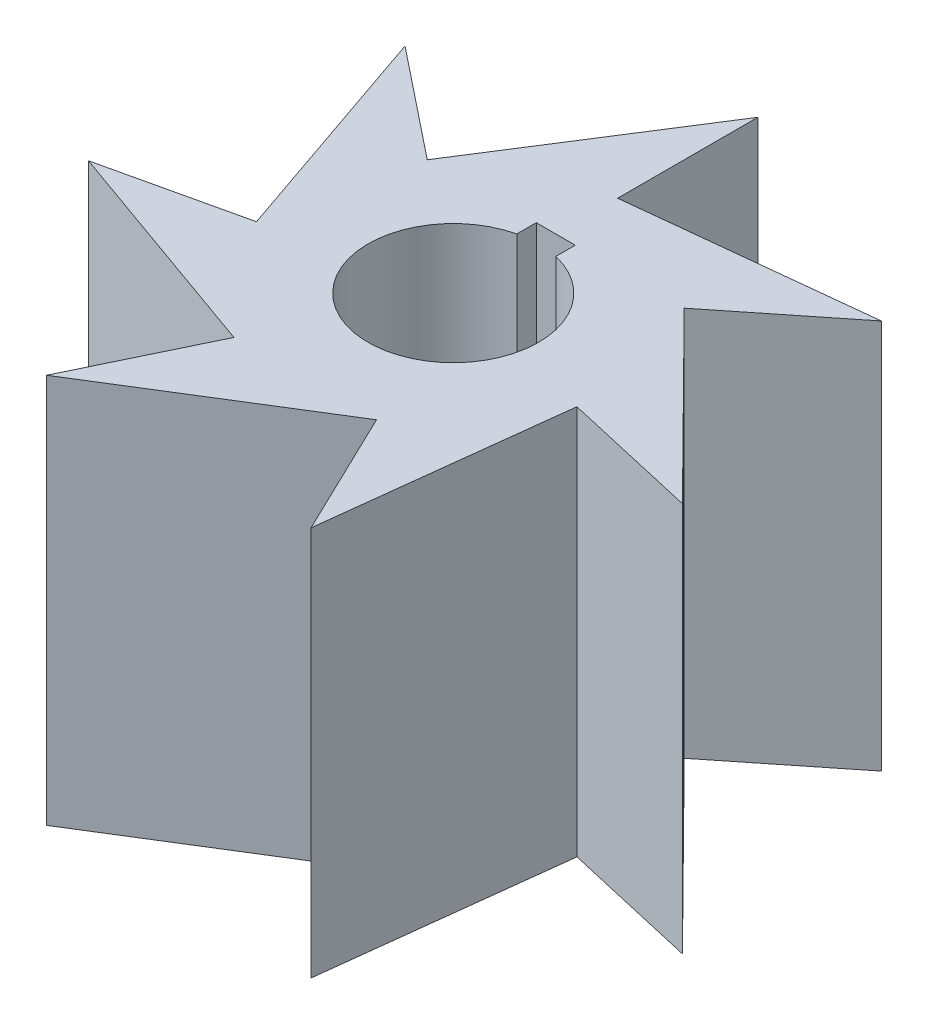
ISO-10303-21;
HEADER;
FILE_DESCRIPTION(('STEP AP214'),'2;1');
FILE_NAME('part.step','',(''),(''),'','','');
FILE_SCHEMA(('AUTOMOTIVE_DESIGN { 1 0 10303 214 1 1 1 1 }'));
ENDSEC;
DATA;
#1=APPLICATION_CONTEXT('core data for automotive mechanical design processes');
#2=APPLICATION_PROTOCOL_DEFINITION('international standard','automotive_design',2000,#1);
#3=PRODUCT_CONTEXT('',#1,'mechanical');
#4=PRODUCT('Part','Part','',(#3));
#5=PRODUCT_RELATED_PRODUCT_CATEGORY('part','',(#4));
#6=PRODUCT_DEFINITION_FORMATION('','',#4);
#7=PRODUCT_DEFINITION_CONTEXT('part definition',#1,'design');
#8=PRODUCT_DEFINITION('design','',#6,#7);
#9=PRODUCT_DEFINITION_SHAPE('','',#8);
#10=(LENGTH_UNIT() NAMED_UNIT(*) SI_UNIT(.MILLI.,.METRE.));
#11=(NAMED_UNIT(*) PLANE_ANGLE_UNIT() SI_UNIT($,.RADIAN.));
#12=(NAMED_UNIT(*) SI_UNIT($,.STERADIAN.) SOLID_ANGLE_UNIT());
#13=UNCERTAINTY_MEASURE_WITH_UNIT(LENGTH_MEASURE(1.E-05),#10,'distance_accuracy_value','');
#14=(GEOMETRIC_REPRESENTATION_CONTEXT(3) GLOBAL_UNCERTAINTY_ASSIGNED_CONTEXT((#13)) GLOBAL_UNIT_ASSIGNED_CONTEXT((#10,
#11,#12)) REPRESENTATION_CONTEXT('',''));
#15=CARTESIAN_POINT('',(0.,0.,0.));
#16=DIRECTION('',(0.,0.,1.));
#17=DIRECTION('',(1.,0.,0.));
#18=AXIS2_PLACEMENT_3D('',#15,#16,#17);
#19=CARTESIAN_POINT('',(0.,80.,0.));
#20=DIRECTION('',(0.,1.,0.));
#21=DIRECTION('',(0.,0.,1.));
#22=AXIS2_PLACEMENT_3D('',#19,#20,#21);
#23=PLANE('',#22);
#24=DIRECTION('',(-0.536459207757481,0.,0.8439262517615));
#25=VECTOR('',#24,1.);
#26=CARTESIAN_POINT('',(-26.3644676542482,80.,-21.0249613663145));
#27=LINE('',#26,#25);
#28=CARTESIAN_POINT('',(0.,80.,-62.4999999999985));
#29=VERTEX_POINT('',#28);
#30=CARTESIAN_POINT('',(-26.3644676542482,80.,-21.0249613663145));
#31=VERTEX_POINT('',#30);
#32=EDGE_CURVE('E194',#29,#31,#27,.T.);
#33=ORIENTED_EDGE('',*,*,#32,.T.);
#34=DIRECTION('',(-0.78183148246803,0.,-0.623489801858734));
#35=VECTOR('',#34,1.);
#36=CARTESIAN_POINT('',(-26.3644676542482,80.,-21.0249613663145));
#37=LINE('',#36,#35);
#38=CARTESIAN_POINT('',(-48.8644676542482,80.,-38.9681126161686));
#39=VERTEX_POINT('',#38);
#40=EDGE_CURVE('E197',#31,#39,#37,.T.);
#41=ORIENTED_EDGE('',*,*,#40,.T.);
#42=DIRECTION('',(0.325331267358377,0.,0.945600109178818));
#43=VECTOR('',#42,1.);
#44=CARTESIAN_POINT('',(-32.8759534277145,80.,7.50372183423167));
#45=LINE('',#44,#43);
#46=CARTESIAN_POINT('',(-32.8759534277145,80.,7.50372183423167));
#47=VERTEX_POINT('',#46);
#48=EDGE_CURVE('E200',#39,#47,#45,.T.);
#49=ORIENTED_EDGE('',*,*,#48,.T.);
#50=DIRECTION('',(-0.974927912181824,0.,0.222520933956314));
#51=VECTOR('',#50,1.);
#52=CARTESIAN_POINT('',(-32.8759534277145,80.,7.50372183423167));
#53=LINE('',#52,#51);
#54=CARTESIAN_POINT('',(-60.9329945113575,80.,13.9075583722695));
#55=VERTEX_POINT('',#54);
#56=EDGE_CURVE('E202',#47,#55,#53,.T.);
#57=ORIENTED_EDGE('',*,*,#56,.T.);
#58=DIRECTION('',(0.942140662604931,0.,0.335217797657495));
#59=VECTOR('',#58,1.);
#60=CARTESIAN_POINT('',(-14.6311757228751,80.,30.3819494455694));
#61=LINE('',#60,#59);
#62=CARTESIAN_POINT('',(-14.6311757228751,80.,30.3819494455694));
#63=VERTEX_POINT('',#62);
#64=EDGE_CURVE('E204',#55,#63,#61,.T.);
#65=ORIENTED_EDGE('',*,*,#64,.T.);
#66=DIRECTION('',(-0.433883739117559,0.,0.900968867902419));
#67=VECTOR('',#66,1.);
#68=CARTESIAN_POINT('',(-14.6311757228751,80.,30.3819494455694));
#69=LINE('',#68,#67);
#70=CARTESIAN_POINT('',(-27.117733694841,80.,56.3105542438974));
#71=VERTEX_POINT('',#70);
#72=EDGE_CURVE('E206',#63,#71,#69,.T.);
#73=ORIENTED_EDGE('',*,*,#72,.T.);
#74=DIRECTION('',(0.849498922742832,0.,-0.527590352696832));
#75=VECTOR('',#74,1.);
#76=CARTESIAN_POINT('',(14.631175722885,80.,30.3819494455671));
#77=LINE('',#76,#75);
#78=CARTESIAN_POINT('',(14.631175722885,80.,30.3819494455671));
#79=VERTEX_POINT('',#78);
#80=EDGE_CURVE('E208',#71,#79,#77,.T.);
#81=ORIENTED_EDGE('',*,*,#80,.T.);
#82=DIRECTION('',(0.433883739117558,0.,0.900968867902419));
#83=VECTOR('',#82,1.);
#84=CARTESIAN_POINT('',(14.631175722885,80.,30.3819494455671));
#85=LINE('',#84,#83);
#86=CARTESIAN_POINT('',(27.1177336948508,80.,56.3105542438951));
#87=VERTEX_POINT('',#86);
#88=EDGE_CURVE('E210',#79,#87,#85,.T.);
#89=ORIENTED_EDGE('',*,*,#88,.T.);
#90=DIRECTION('',(0.117167167435341,0.,-0.99311220658855));
#91=VECTOR('',#90,1.);
#92=CARTESIAN_POINT('',(32.8759534277208,80.,7.50372183422662));
#93=LINE('',#92,#91);
#94=CARTESIAN_POINT('',(32.8759534277208,80.,7.50372183422662));
#95=VERTEX_POINT('',#94);
#96=EDGE_CURVE('E212',#87,#95,#93,.T.);
#97=ORIENTED_EDGE('',*,*,#96,.T.);
#98=DIRECTION('',(0.974927912181824,0.,0.222520933956315));
#99=VECTOR('',#98,1.);
#100=CARTESIAN_POINT('',(32.8759534277208,80.,7.50372183422662));
#101=LINE('',#100,#99);
#102=CARTESIAN_POINT('',(60.9329945113638,80.,13.9075583722645));
#103=VERTEX_POINT('',#102);
#104=EDGE_CURVE('E214',#95,#103,#101,.T.);
#105=ORIENTED_EDGE('',*,*,#104,.T.);
#106=DIRECTION('',(-0.703393854725609,0.,-0.71080031312194));
#107=VECTOR('',#106,1.);
#108=CARTESIAN_POINT('',(26.3644676542504,80.,-21.0249613663187));
#109=LINE('',#108,#107);
#110=CARTESIAN_POINT('',(26.3644676542504,80.,-21.0249613663187));
#111=VERTEX_POINT('',#110);
#112=EDGE_CURVE('E216',#103,#111,#109,.T.);
#113=ORIENTED_EDGE('',*,*,#112,.T.);
#114=DIRECTION('',(0.781831482468029,0.,-0.623489801858735));
#115=VECTOR('',#114,1.);
#116=CARTESIAN_POINT('',(26.3644676542504,80.,-21.0249613663187));
#117=LINE('',#116,#115);
#118=CARTESIAN_POINT('',(48.8644676542502,80.,-38.9681126161726));
#119=VERTEX_POINT('',#118);
#120=EDGE_CURVE('E218',#111,#119,#117,.T.);
#121=ORIENTED_EDGE('',*,*,#120,.T.);
#122=DIRECTION('',(-0.994284957658387,0.,0.106758713809501));
#123=VECTOR('',#122,1.);
#124=CARTESIAN_POINT('',(-5.93275428784068E-13,80.,-33.7214198269752));
#125=LINE('',#124,#123);
#126=CARTESIAN_POINT('',(-5.93275428784068E-13,80.,-33.7214198269752));
#127=VERTEX_POINT('',#126);
#128=EDGE_CURVE('E220',#119,#127,#125,.T.);
#129=ORIENTED_EDGE('',*,*,#128,.T.);
#130=DIRECTION('',(0.,0.,-1.));
#131=VECTOR('',#130,1.);
#132=CARTESIAN_POINT('',(-5.93275428784068E-13,80.,-33.7214198269752));
#133=LINE('',#132,#131);
#134=EDGE_CURVE('E222',#127,#29,#133,.T.);
#135=ORIENTED_EDGE('',*,*,#134,.T.);
#136=EDGE_LOOP('',(#33,#41,#49,#57,#65,#73,#81,#89,#97,#105,#113,#121,#129,#135));
#137=FACE_BOUND('',#136,.T.);
#138=DIRECTION('',(0.,0.,-1.));
#139=VECTOR('',#138,1.);
#140=CARTESIAN_POINT('',(4.,80.,-21.0367250374008));
#141=LINE('',#140,#139);
#142=CARTESIAN_POINT('',(4.,80.,-17.0367250374008));
#143=VERTEX_POINT('',#142);
#144=CARTESIAN_POINT('',(4.,80.,-21.0367250374008));
#145=VERTEX_POINT('',#144);
#146=EDGE_CURVE('E166',#143,#145,#141,.T.);
#147=ORIENTED_EDGE('',*,*,#146,.F.);
#148=CARTESIAN_POINT('',(0.,80.,0.));
#149=DIRECTION('',(0.,1.,0.));
#150=DIRECTION('',(0.,0.,1.));
#151=AXIS2_PLACEMENT_3D('',#148,#149,#150);
#152=CIRCLE('',#151,17.5);
#153=CARTESIAN_POINT('',(-4.,80.,-17.0367250374008));
#154=VERTEX_POINT('',#153);
#155=EDGE_CURVE('E158',#154,#143,#152,.T.);
#156=ORIENTED_EDGE('',*,*,#155,.F.);
#157=DIRECTION('',(0.,0.,1.));
#158=VECTOR('',#157,1.);
#159=CARTESIAN_POINT('',(-4.,80.,-17.0367250374008));
#160=LINE('',#159,#158);
#161=CARTESIAN_POINT('',(-4.,80.,-21.0367250374008));
#162=VERTEX_POINT('',#161);
#163=EDGE_CURVE('E180',#162,#154,#160,.T.);
#164=ORIENTED_EDGE('',*,*,#163,.F.);
#165=DIRECTION('',(-1.,0.,0.));
#166=VECTOR('',#165,1.);
#167=CARTESIAN_POINT('',(-4.,80.,-21.0367250374008));
#168=LINE('',#167,#166);
#169=EDGE_CURVE('E178',#145,#162,#168,.T.);
#170=ORIENTED_EDGE('',*,*,#169,.F.);
#171=EDGE_LOOP('',(#147,#156,#164,#170));
#172=FACE_BOUND('',#171,.T.);
#173=ADVANCED_FACE('F33',(#137,#172),#23,.T.);
#174=CARTESIAN_POINT('',(0.,0.,0.));
#175=DIRECTION('',(0.,1.,0.));
#176=DIRECTION('',(0.,0.,1.));
#177=AXIS2_PLACEMENT_3D('',#174,#175,#176);
#178=PLANE('',#177);
#179=DIRECTION('',(-0.536459207757481,0.,0.8439262517615));
#180=VECTOR('',#179,1.);
#181=CARTESIAN_POINT('',(-26.3644676542482,0.,-21.0249613663145));
#182=LINE('',#181,#180);
#183=CARTESIAN_POINT('',(0.,0.,-62.4999999999985));
#184=VERTEX_POINT('',#183);
#185=CARTESIAN_POINT('',(-26.3644676542482,0.,-21.0249613663145));
#186=VERTEX_POINT('',#185);
#187=EDGE_CURVE('E174',#184,#186,#182,.T.);
#188=ORIENTED_EDGE('',*,*,#187,.F.);
#189=DIRECTION('',(0.,0.,-1.));
#190=VECTOR('',#189,1.);
#191=CARTESIAN_POINT('',(-5.93275428784068E-13,0.,-33.7214198269752));
#192=LINE('',#191,#190);
#193=CARTESIAN_POINT('',(-5.93275428784068E-13,0.,-33.7214198269752));
#194=VERTEX_POINT('',#193);
#195=EDGE_CURVE('E198',#194,#184,#192,.T.);
#196=ORIENTED_EDGE('',*,*,#195,.F.);
#197=DIRECTION('',(-0.994284957658387,0.,0.106758713809501));
#198=VECTOR('',#197,1.);
#199=CARTESIAN_POINT('',(-5.93275428784068E-13,0.,-33.7214198269752));
#200=LINE('',#199,#198);
#201=CARTESIAN_POINT('',(48.8644676542502,0.,-38.9681126161726));
#202=VERTEX_POINT('',#201);
#203=EDGE_CURVE('E249',#202,#194,#200,.T.);
#204=ORIENTED_EDGE('',*,*,#203,.F.);
#205=DIRECTION('',(0.781831482468029,0.,-0.623489801858735));
#206=VECTOR('',#205,1.);
#207=CARTESIAN_POINT('',(26.3644676542504,0.,-21.0249613663187));
#208=LINE('',#207,#206);
#209=CARTESIAN_POINT('',(26.3644676542504,0.,-21.0249613663187));
#210=VERTEX_POINT('',#209);
#211=EDGE_CURVE('E247',#210,#202,#208,.T.);
#212=ORIENTED_EDGE('',*,*,#211,.F.);
#213=DIRECTION('',(-0.703393854725609,0.,-0.71080031312194));
#214=VECTOR('',#213,1.);
#215=CARTESIAN_POINT('',(26.3644676542504,0.,-21.0249613663187));
#216=LINE('',#215,#214);
#217=CARTESIAN_POINT('',(60.9329945113638,0.,13.9075583722645));
#218=VERTEX_POINT('',#217);
#219=EDGE_CURVE('E245',#218,#210,#216,.T.);
#220=ORIENTED_EDGE('',*,*,#219,.F.);
#221=DIRECTION('',(0.974927912181824,0.,0.222520933956315));
#222=VECTOR('',#221,1.);
#223=CARTESIAN_POINT('',(32.8759534277208,0.,7.50372183422662));
#224=LINE('',#223,#222);
#225=CARTESIAN_POINT('',(32.8759534277208,0.,7.50372183422662));
#226=VERTEX_POINT('',#225);
#227=EDGE_CURVE('E243',#226,#218,#224,.T.);
#228=ORIENTED_EDGE('',*,*,#227,.F.);
#229=DIRECTION('',(0.117167167435341,0.,-0.99311220658855));
#230=VECTOR('',#229,1.);
#231=CARTESIAN_POINT('',(32.8759534277208,0.,7.50372183422662));
#232=LINE('',#231,#230);
#233=CARTESIAN_POINT('',(27.1177336948508,0.,56.3105542438951));
#234=VERTEX_POINT('',#233);
#235=EDGE_CURVE('E241',#234,#226,#232,.T.);
#236=ORIENTED_EDGE('',*,*,#235,.F.);
#237=DIRECTION('',(0.433883739117558,0.,0.900968867902419));
#238=VECTOR('',#237,1.);
#239=CARTESIAN_POINT('',(14.631175722885,0.,30.3819494455671));
#240=LINE('',#239,#238);
#241=CARTESIAN_POINT('',(14.631175722885,0.,30.3819494455671));
#242=VERTEX_POINT('',#241);
#243=EDGE_CURVE('E239',#242,#234,#240,.T.);
#244=ORIENTED_EDGE('',*,*,#243,.F.);
#245=DIRECTION('',(0.849498922742832,0.,-0.527590352696832));
#246=VECTOR('',#245,1.);
#247=CARTESIAN_POINT('',(14.631175722885,0.,30.3819494455671));
#248=LINE('',#247,#246);
#249=CARTESIAN_POINT('',(-27.117733694841,0.,56.3105542438974));
#250=VERTEX_POINT('',#249);
#251=EDGE_CURVE('E237',#250,#242,#248,.T.);
#252=ORIENTED_EDGE('',*,*,#251,.F.);
#253=DIRECTION('',(-0.433883739117559,0.,0.900968867902419));
#254=VECTOR('',#253,1.);
#255=CARTESIAN_POINT('',(-14.6311757228751,0.,30.3819494455694));
#256=LINE('',#255,#254);
#257=CARTESIAN_POINT('',(-14.6311757228751,0.,30.3819494455694));
#258=VERTEX_POINT('',#257);
#259=EDGE_CURVE('E235',#258,#250,#256,.T.);
#260=ORIENTED_EDGE('',*,*,#259,.F.);
#261=DIRECTION('',(0.942140662604931,0.,0.335217797657495));
#262=VECTOR('',#261,1.);
#263=CARTESIAN_POINT('',(-14.6311757228751,0.,30.3819494455694));
#264=LINE('',#263,#262);
#265=CARTESIAN_POINT('',(-60.9329945113575,0.,13.9075583722695));
#266=VERTEX_POINT('',#265);
#267=EDGE_CURVE('E233',#266,#258,#264,.T.);
#268=ORIENTED_EDGE('',*,*,#267,.F.);
#269=DIRECTION('',(-0.974927912181824,0.,0.222520933956314));
#270=VECTOR('',#269,1.);
#271=CARTESIAN_POINT('',(-32.8759534277145,0.,7.50372183423167));
#272=LINE('',#271,#270);
#273=CARTESIAN_POINT('',(-32.8759534277145,0.,7.50372183423167));
#274=VERTEX_POINT('',#273);
#275=EDGE_CURVE('E231',#274,#266,#272,.T.);
#276=ORIENTED_EDGE('',*,*,#275,.F.);
#277=DIRECTION('',(0.325331267358377,0.,0.945600109178818));
#278=VECTOR('',#277,1.);
#279=CARTESIAN_POINT('',(-32.8759534277145,0.,7.50372183423167));
#280=LINE('',#279,#278);
#281=CARTESIAN_POINT('',(-48.8644676542482,0.,-38.9681126161686));
#282=VERTEX_POINT('',#281);
#283=EDGE_CURVE('E229',#282,#274,#280,.T.);
#284=ORIENTED_EDGE('',*,*,#283,.F.);
#285=DIRECTION('',(-0.78183148246803,0.,-0.623489801858734));
#286=VECTOR('',#285,1.);
#287=CARTESIAN_POINT('',(-26.3644676542482,0.,-21.0249613663145));
#288=LINE('',#287,#286);
#289=EDGE_CURVE('E227',#186,#282,#288,.T.);
#290=ORIENTED_EDGE('',*,*,#289,.F.);
#291=EDGE_LOOP('',(#188,#196,#204,#212,#220,#228,#236,#244,#252,#260,#268,#276,#284,#290));
#292=FACE_BOUND('',#291,.T.);
#293=CARTESIAN_POINT('',(0.,0.,0.));
#294=DIRECTION('',(0.,1.,0.));
#295=DIRECTION('',(0.,0.,1.));
#296=AXIS2_PLACEMENT_3D('',#293,#294,#295);
#297=CIRCLE('',#296,17.5);
#298=CARTESIAN_POINT('',(-4.,0.,-17.0367250374008));
#299=VERTEX_POINT('',#298);
#300=CARTESIAN_POINT('',(4.,0.,-17.0367250374008));
#301=VERTEX_POINT('',#300);
#302=EDGE_CURVE('E56',#299,#301,#297,.T.);
#303=ORIENTED_EDGE('',*,*,#302,.T.);
#304=DIRECTION('',(0.,0.,-1.));
#305=VECTOR('',#304,1.);
#306=CARTESIAN_POINT('',(4.,0.,-21.0367250374008));
#307=LINE('',#306,#305);
#308=CARTESIAN_POINT('',(4.,0.,-21.0367250374008));
#309=VERTEX_POINT('',#308);
#310=EDGE_CURVE('E173',#301,#309,#307,.T.);
#311=ORIENTED_EDGE('',*,*,#310,.T.);
#312=DIRECTION('',(-1.,0.,0.));
#313=VECTOR('',#312,1.);
#314=CARTESIAN_POINT('',(-4.,0.,-21.0367250374008));
#315=LINE('',#314,#313);
#316=CARTESIAN_POINT('',(-4.,0.,-21.0367250374008));
#317=VERTEX_POINT('',#316);
#318=EDGE_CURVE('E186',#309,#317,#315,.T.);
#319=ORIENTED_EDGE('',*,*,#318,.T.);
#320=DIRECTION('',(0.,0.,1.));
#321=VECTOR('',#320,1.);
#322=CARTESIAN_POINT('',(-4.,0.,-17.0367250374008));
#323=LINE('',#322,#321);
#324=EDGE_CURVE('E167',#317,#299,#323,.T.);
#325=ORIENTED_EDGE('',*,*,#324,.T.);
#326=EDGE_LOOP('',(#303,#311,#319,#325));
#327=FACE_BOUND('',#326,.T.);
#328=ADVANCED_FACE('F297',(#292,#327),#178,.F.);
#329=CARTESIAN_POINT('',(-26.3644676542482,80.,-21.0249613663145));
#330=DIRECTION('',(0.8439262517615,0.,0.536459207757481));
#331=DIRECTION('',(0.536459207757481,0.,-0.8439262517615));
#332=AXIS2_PLACEMENT_3D('',#329,#330,#331);
#333=PLANE('',#332);
#334=ORIENTED_EDGE('',*,*,#187,.T.);
#335=DIRECTION('',(0.,-1.,0.));
#336=VECTOR('',#335,1.);
#337=CARTESIAN_POINT('',(-26.3644676542482,80.,-21.0249613663145));
#338=LINE('',#337,#336);
#339=EDGE_CURVE('E11',#31,#186,#338,.T.);
#340=ORIENTED_EDGE('',*,*,#339,.F.);
#341=ORIENTED_EDGE('',*,*,#32,.F.);
#342=DIRECTION('',(0.,-1.,0.));
#343=VECTOR('',#342,1.);
#344=CARTESIAN_POINT('',(0.,80.,-62.4999999999985));
#345=LINE('',#344,#343);
#346=EDGE_CURVE('E224',#29,#184,#345,.T.);
#347=ORIENTED_EDGE('',*,*,#346,.T.);
#348=EDGE_LOOP('',(#334,#340,#341,#347));
#349=FACE_BOUND('',#348,.T.);
#350=ADVANCED_FACE('F35',(#349),#333,.F.);
#351=CARTESIAN_POINT('',(-26.3644676542482,80.,-21.0249613663145));
#352=DIRECTION('',(-0.623489801858734,0.,0.78183148246803));
#353=DIRECTION('',(0.78183148246803,0.,0.623489801858734));
#354=AXIS2_PLACEMENT_3D('',#351,#352,#353);
#355=PLANE('',#354);
#356=ORIENTED_EDGE('',*,*,#289,.T.);
#357=DIRECTION('',(0.,-1.,0.));
#358=VECTOR('',#357,1.);
#359=CARTESIAN_POINT('',(-48.8644676542482,80.,-38.9681126161686));
#360=LINE('',#359,#358);
#361=EDGE_CURVE('E41',#39,#282,#360,.T.);
#362=ORIENTED_EDGE('',*,*,#361,.F.);
#363=ORIENTED_EDGE('',*,*,#40,.F.);
#364=ORIENTED_EDGE('',*,*,#339,.T.);
#365=EDGE_LOOP('',(#356,#362,#363,#364));
#366=FACE_BOUND('',#365,.T.);
#367=ADVANCED_FACE('F314',(#366),#355,.F.);
#368=CARTESIAN_POINT('',(-32.8759534277145,80.,7.50372183423167));
#369=DIRECTION('',(0.945600109178818,0.,-0.325331267358377));
#370=DIRECTION('',(-0.325331267358377,0.,-0.945600109178818));
#371=AXIS2_PLACEMENT_3D('',#368,#369,#370);
#372=PLANE('',#371);
#373=ORIENTED_EDGE('',*,*,#283,.T.);
#374=DIRECTION('',(0.,-1.,0.));
#375=VECTOR('',#374,1.);
#376=CARTESIAN_POINT('',(-32.8759534277145,80.,7.50372183423167));
#377=LINE('',#376,#375);
#378=EDGE_CURVE('E284',#47,#274,#377,.T.);
#379=ORIENTED_EDGE('',*,*,#378,.F.);
#380=ORIENTED_EDGE('',*,*,#48,.F.);
#381=ORIENTED_EDGE('',*,*,#361,.T.);
#382=EDGE_LOOP('',(#373,#379,#380,#381));
#383=FACE_BOUND('',#382,.T.);
#384=ADVANCED_FACE('F291',(#383),#372,.F.);
#385=CARTESIAN_POINT('',(-32.8759534277145,80.,7.50372183423167));
#386=DIRECTION('',(0.222520933956314,0.,0.974927912181824));
#387=DIRECTION('',(0.974927912181824,0.,-0.222520933956314));
#388=AXIS2_PLACEMENT_3D('',#385,#386,#387);
#389=PLANE('',#388);
#390=ORIENTED_EDGE('',*,*,#275,.T.);
#391=DIRECTION('',(0.,-1.,0.));
#392=VECTOR('',#391,1.);
#393=CARTESIAN_POINT('',(-60.9329945113575,80.,13.9075583722695));
#394=LINE('',#393,#392);
#395=EDGE_CURVE('E281',#55,#266,#394,.T.);
#396=ORIENTED_EDGE('',*,*,#395,.F.);
#397=ORIENTED_EDGE('',*,*,#56,.F.);
#398=ORIENTED_EDGE('',*,*,#378,.T.);
#399=EDGE_LOOP('',(#390,#396,#397,#398));
#400=FACE_BOUND('',#399,.T.);
#401=ADVANCED_FACE('F303',(#400),#389,.F.);
#402=CARTESIAN_POINT('',(-14.6311757228751,80.,30.3819494455694));
#403=DIRECTION('',(0.335217797657495,0.,-0.942140662604931));
#404=DIRECTION('',(-0.942140662604931,0.,-0.335217797657495));
#405=AXIS2_PLACEMENT_3D('',#402,#403,#404);
#406=PLANE('',#405);
#407=ORIENTED_EDGE('',*,*,#267,.T.);
#408=DIRECTION('',(0.,-1.,0.));
#409=VECTOR('',#408,1.);
#410=CARTESIAN_POINT('',(-14.6311757228751,80.,30.3819494455694));
#411=LINE('',#410,#409);
#412=EDGE_CURVE('E278',#63,#258,#411,.T.);
#413=ORIENTED_EDGE('',*,*,#412,.F.);
#414=ORIENTED_EDGE('',*,*,#64,.F.);
#415=ORIENTED_EDGE('',*,*,#395,.T.);
#416=EDGE_LOOP('',(#407,#413,#414,#415));
#417=FACE_BOUND('',#416,.T.);
#418=ADVANCED_FACE('F307',(#417),#406,.F.);
#419=CARTESIAN_POINT('',(-14.6311757228751,80.,30.3819494455694));
#420=DIRECTION('',(0.900968867902419,0.,0.433883739117559));
#421=DIRECTION('',(0.433883739117559,0.,-0.900968867902419));
#422=AXIS2_PLACEMENT_3D('',#419,#420,#421);
#423=PLANE('',#422);
#424=ORIENTED_EDGE('',*,*,#259,.T.);
#425=DIRECTION('',(0.,-1.,0.));
#426=VECTOR('',#425,1.);
#427=CARTESIAN_POINT('',(-27.117733694841,80.,56.3105542438974));
#428=LINE('',#427,#426);
#429=EDGE_CURVE('E275',#71,#250,#428,.T.);
#430=ORIENTED_EDGE('',*,*,#429,.F.);
#431=ORIENTED_EDGE('',*,*,#72,.F.);
#432=ORIENTED_EDGE('',*,*,#412,.T.);
#433=EDGE_LOOP('',(#424,#430,#431,#432));
#434=FACE_BOUND('',#433,.T.);
#435=ADVANCED_FACE('F357',(#434),#423,.F.);
#436=CARTESIAN_POINT('',(14.631175722885,80.,30.3819494455671));
#437=DIRECTION('',(-0.527590352696832,0.,-0.849498922742832));
#438=DIRECTION('',(-0.849498922742832,0.,0.527590352696832));
#439=AXIS2_PLACEMENT_3D('',#436,#437,#438);
#440=PLANE('',#439);
#441=ORIENTED_EDGE('',*,*,#251,.T.);
#442=DIRECTION('',(0.,-1.,0.));
#443=VECTOR('',#442,1.);
#444=CARTESIAN_POINT('',(14.631175722885,80.,30.3819494455671));
#445=LINE('',#444,#443);
#446=EDGE_CURVE('E272',#79,#242,#445,.T.);
#447=ORIENTED_EDGE('',*,*,#446,.F.);
#448=ORIENTED_EDGE('',*,*,#80,.F.);
#449=ORIENTED_EDGE('',*,*,#429,.T.);
#450=EDGE_LOOP('',(#441,#447,#448,#449));
#451=FACE_BOUND('',#450,.T.);
#452=ADVANCED_FACE('F355',(#451),#440,.F.);
#453=CARTESIAN_POINT('',(14.631175722885,80.,30.3819494455671));
#454=DIRECTION('',(0.900968867902419,0.,-0.433883739117558));
#455=DIRECTION('',(-0.433883739117558,0.,-0.900968867902419));
#456=AXIS2_PLACEMENT_3D('',#453,#454,#455);
#457=PLANE('',#456);
#458=ORIENTED_EDGE('',*,*,#243,.T.);
#459=DIRECTION('',(0.,-1.,0.));
#460=VECTOR('',#459,1.);
#461=CARTESIAN_POINT('',(27.1177336948508,80.,56.3105542438951));
#462=LINE('',#461,#460);
#463=EDGE_CURVE('E269',#87,#234,#462,.T.);
#464=ORIENTED_EDGE('',*,*,#463,.F.);
#465=ORIENTED_EDGE('',*,*,#88,.F.);
#466=ORIENTED_EDGE('',*,*,#446,.T.);
#467=EDGE_LOOP('',(#458,#464,#465,#466));
#468=FACE_BOUND('',#467,.T.);
#469=ADVANCED_FACE('F350',(#468),#457,.F.);
#470=CARTESIAN_POINT('',(32.8759534277208,80.,7.50372183422662));
#471=DIRECTION('',(-0.99311220658855,0.,-0.117167167435341));
#472=DIRECTION('',(-0.117167167435341,0.,0.99311220658855));
#473=AXIS2_PLACEMENT_3D('',#470,#471,#472);
#474=PLANE('',#473);
#475=ORIENTED_EDGE('',*,*,#235,.T.);
#476=DIRECTION('',(0.,-1.,0.));
#477=VECTOR('',#476,1.);
#478=CARTESIAN_POINT('',(32.8759534277208,80.,7.50372183422662));
#479=LINE('',#478,#477);
#480=EDGE_CURVE('E266',#95,#226,#479,.T.);
#481=ORIENTED_EDGE('',*,*,#480,.F.);
#482=ORIENTED_EDGE('',*,*,#96,.F.);
#483=ORIENTED_EDGE('',*,*,#463,.T.);
#484=EDGE_LOOP('',(#475,#481,#482,#483));
#485=FACE_BOUND('',#484,.T.);
#486=ADVANCED_FACE('F345',(#485),#474,.F.);
#487=CARTESIAN_POINT('',(32.8759534277208,80.,7.50372183422662));
#488=DIRECTION('',(0.222520933956315,0.,-0.974927912181824));
#489=DIRECTION('',(-0.974927912181824,0.,-0.222520933956315));
#490=AXIS2_PLACEMENT_3D('',#487,#488,#489);
#491=PLANE('',#490);
#492=ORIENTED_EDGE('',*,*,#227,.T.);
#493=DIRECTION('',(0.,-1.,0.));
#494=VECTOR('',#493,1.);
#495=CARTESIAN_POINT('',(60.9329945113638,80.,13.9075583722645));
#496=LINE('',#495,#494);
#497=EDGE_CURVE('E263',#103,#218,#496,.T.);
#498=ORIENTED_EDGE('',*,*,#497,.F.);
#499=ORIENTED_EDGE('',*,*,#104,.F.);
#500=ORIENTED_EDGE('',*,*,#480,.T.);
#501=EDGE_LOOP('',(#492,#498,#499,#500));
#502=FACE_BOUND('',#501,.T.);
#503=ADVANCED_FACE('F341',(#502),#491,.F.);
#504=CARTESIAN_POINT('',(26.3644676542504,80.,-21.0249613663187));
#505=DIRECTION('',(-0.71080031312194,0.,0.703393854725609));
#506=DIRECTION('',(0.703393854725609,0.,0.710800313121941));
#507=AXIS2_PLACEMENT_3D('',#504,#505,#506);
#508=PLANE('',#507);
#509=ORIENTED_EDGE('',*,*,#219,.T.);
#510=DIRECTION('',(0.,-1.,0.));
#511=VECTOR('',#510,1.);
#512=CARTESIAN_POINT('',(26.3644676542504,80.,-21.0249613663187));
#513=LINE('',#512,#511);
#514=EDGE_CURVE('E260',#111,#210,#513,.T.);
#515=ORIENTED_EDGE('',*,*,#514,.F.);
#516=ORIENTED_EDGE('',*,*,#112,.F.);
#517=ORIENTED_EDGE('',*,*,#497,.T.);
#518=EDGE_LOOP('',(#509,#515,#516,#517));
#519=FACE_BOUND('',#518,.T.);
#520=ADVANCED_FACE('F336',(#519),#508,.F.);
#521=CARTESIAN_POINT('',(26.3644676542504,80.,-21.0249613663187));
#522=DIRECTION('',(-0.623489801858735,0.,-0.781831482468029));
#523=DIRECTION('',(-0.781831482468029,0.,0.623489801858735));
#524=AXIS2_PLACEMENT_3D('',#521,#522,#523);
#525=PLANE('',#524);
#526=ORIENTED_EDGE('',*,*,#211,.T.);
#527=DIRECTION('',(0.,-1.,0.));
#528=VECTOR('',#527,1.);
#529=CARTESIAN_POINT('',(48.8644676542502,80.,-38.9681126161726));
#530=LINE('',#529,#528);
#531=EDGE_CURVE('E257',#119,#202,#530,.T.);
#532=ORIENTED_EDGE('',*,*,#531,.F.);
#533=ORIENTED_EDGE('',*,*,#120,.F.);
#534=ORIENTED_EDGE('',*,*,#514,.T.);
#535=EDGE_LOOP('',(#526,#532,#533,#534));
#536=FACE_BOUND('',#535,.T.);
#537=ADVANCED_FACE('F330',(#536),#525,.F.);
#538=CARTESIAN_POINT('',(-5.93275428784068E-13,80.,-33.7214198269752));
#539=DIRECTION('',(0.106758713809501,0.,0.994284957658387));
#540=DIRECTION('',(0.994284957658387,0.,-0.106758713809501));
#541=AXIS2_PLACEMENT_3D('',#538,#539,#540);
#542=PLANE('',#541);
#543=ORIENTED_EDGE('',*,*,#203,.T.);
#544=DIRECTION('',(0.,-1.,0.));
#545=VECTOR('',#544,1.);
#546=CARTESIAN_POINT('',(-5.93275428784068E-13,80.,-33.7214198269752));
#547=LINE('',#546,#545);
#548=EDGE_CURVE('E254',#127,#194,#547,.T.);
#549=ORIENTED_EDGE('',*,*,#548,.F.);
#550=ORIENTED_EDGE('',*,*,#128,.F.);
#551=ORIENTED_EDGE('',*,*,#531,.T.);
#552=EDGE_LOOP('',(#543,#549,#550,#551));
#553=FACE_BOUND('',#552,.T.);
#554=ADVANCED_FACE('F326',(#553),#542,.F.);
#555=CARTESIAN_POINT('',(-5.93275428784068E-13,80.,-33.7214198269752));
#556=DIRECTION('',(-1.,0.,0.));
#557=DIRECTION('',(0.,0.,1.));
#558=AXIS2_PLACEMENT_3D('',#555,#556,#557);
#559=PLANE('',#558);
#560=ORIENTED_EDGE('',*,*,#195,.T.);
#561=ORIENTED_EDGE('',*,*,#346,.F.);
#562=ORIENTED_EDGE('',*,*,#134,.F.);
#563=ORIENTED_EDGE('',*,*,#548,.T.);
#564=EDGE_LOOP('',(#560,#561,#562,#563));
#565=FACE_BOUND('',#564,.T.);
#566=ADVANCED_FACE('F321',(#565),#559,.F.);
#567=CARTESIAN_POINT('',(0.,80.,0.));
#568=DIRECTION('',(0.,-1.,0.));
#569=DIRECTION('',(0.,0.,-1.));
#570=AXIS2_PLACEMENT_3D('',#567,#568,#569);
#571=CYLINDRICAL_SURFACE('',#570,17.5);
#572=ORIENTED_EDGE('',*,*,#302,.F.);
#573=DIRECTION('',(0.,-1.,0.));
#574=VECTOR('',#573,1.);
#575=CARTESIAN_POINT('',(-4.,80.,-17.0367250374008));
#576=LINE('',#575,#574);
#577=EDGE_CURVE('E162',#154,#299,#576,.T.);
#578=ORIENTED_EDGE('',*,*,#577,.F.);
#579=ORIENTED_EDGE('',*,*,#155,.T.);
#580=DIRECTION('',(0.,-1.,0.));
#581=VECTOR('',#580,1.);
#582=CARTESIAN_POINT('',(4.,80.,-17.0367250374008));
#583=LINE('',#582,#581);
#584=EDGE_CURVE('E161',#143,#301,#583,.T.);
#585=ORIENTED_EDGE('',*,*,#584,.T.);
#586=EDGE_LOOP('',(#572,#578,#579,#585));
#587=FACE_BOUND('',#586,.T.);
#588=ADVANCED_FACE('F160',(#587),#571,.F.);
#589=CARTESIAN_POINT('',(4.,80.,-21.0367250374008));
#590=DIRECTION('',(-1.,0.,0.));
#591=DIRECTION('',(0.,0.,1.));
#592=AXIS2_PLACEMENT_3D('',#589,#590,#591);
#593=PLANE('',#592);
#594=ORIENTED_EDGE('',*,*,#310,.F.);
#595=ORIENTED_EDGE('',*,*,#584,.F.);
#596=ORIENTED_EDGE('',*,*,#146,.T.);
#597=DIRECTION('',(0.,-1.,0.));
#598=VECTOR('',#597,1.);
#599=CARTESIAN_POINT('',(4.,80.,-21.0367250374008));
#600=LINE('',#599,#598);
#601=EDGE_CURVE('E175',#145,#309,#600,.T.);
#602=ORIENTED_EDGE('',*,*,#601,.T.);
#603=EDGE_LOOP('',(#594,#595,#596,#602));
#604=FACE_BOUND('',#603,.T.);
#605=ADVANCED_FACE('F170',(#604),#593,.T.);
#606=CARTESIAN_POINT('',(-4.,80.,-21.0367250374008));
#607=DIRECTION('',(0.,0.,1.));
#608=DIRECTION('',(1.,0.,0.));
#609=AXIS2_PLACEMENT_3D('',#606,#607,#608);
#610=PLANE('',#609);
#611=ORIENTED_EDGE('',*,*,#318,.F.);
#612=ORIENTED_EDGE('',*,*,#601,.F.);
#613=ORIENTED_EDGE('',*,*,#169,.T.);
#614=DIRECTION('',(0.,-1.,0.));
#615=VECTOR('',#614,1.);
#616=CARTESIAN_POINT('',(-4.,80.,-21.0367250374008));
#617=LINE('',#616,#615);
#618=EDGE_CURVE('E48',#162,#317,#617,.T.);
#619=ORIENTED_EDGE('',*,*,#618,.T.);
#620=EDGE_LOOP('',(#611,#612,#613,#619));
#621=FACE_BOUND('',#620,.T.);
#622=ADVANCED_FACE('F427',(#621),#610,.T.);
#623=CARTESIAN_POINT('',(-4.,80.,-17.0367250374008));
#624=DIRECTION('',(1.,0.,0.));
#625=DIRECTION('',(0.,0.,-1.));
#626=AXIS2_PLACEMENT_3D('',#623,#624,#625);
#627=PLANE('',#626);
#628=ORIENTED_EDGE('',*,*,#324,.F.);
#629=ORIENTED_EDGE('',*,*,#618,.F.);
#630=ORIENTED_EDGE('',*,*,#163,.T.);
#631=ORIENTED_EDGE('',*,*,#577,.T.);
#632=EDGE_LOOP('',(#628,#629,#630,#631));
#633=FACE_BOUND('',#632,.T.);
#634=ADVANCED_FACE('F433',(#633),#627,.T.);
#635=CLOSED_SHELL('',(#173,#328,#350,#367,#384,#401,#418,#435,#452,#469,#486,#503,#520,#537,
#554,#566,#588,#605,#622,#634));
#636=MANIFOLD_SOLID_BREP('B2',#635);
#637=ADVANCED_BREP_SHAPE_REPRESENTATION('',(#18,#636),#14);
#638=SHAPE_DEFINITION_REPRESENTATION(#9,#637);
ENDSEC;
END-ISO-10303-21;
